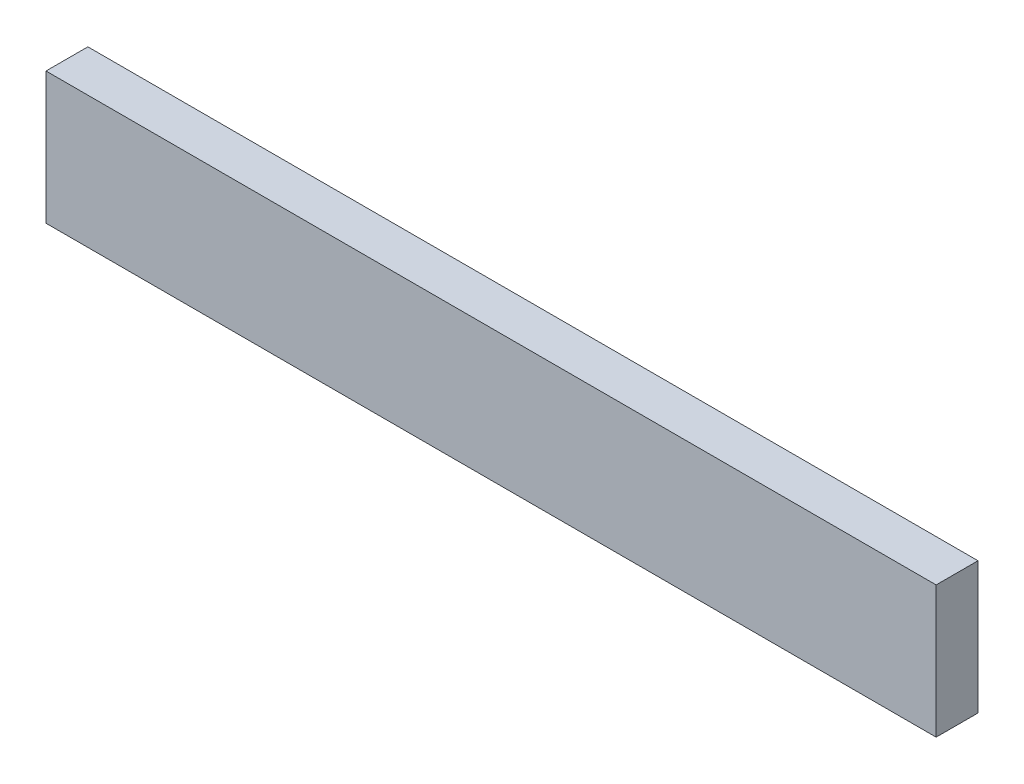
ISO-10303-21;
HEADER;
FILE_DESCRIPTION(('STEP AP214'),'2;1');
FILE_NAME('part.step','',(''),(''),'','','');
FILE_SCHEMA(('AUTOMOTIVE_DESIGN { 1 0 10303 214 1 1 1 1 }'));
ENDSEC;
DATA;
#1=APPLICATION_CONTEXT('core data for automotive mechanical design processes');
#2=APPLICATION_PROTOCOL_DEFINITION('international standard','automotive_design',2000,#1);
#3=PRODUCT_CONTEXT('',#1,'mechanical');
#4=PRODUCT('Part','Part','',(#3));
#5=PRODUCT_RELATED_PRODUCT_CATEGORY('part','',(#4));
#6=PRODUCT_DEFINITION_FORMATION('','',#4);
#7=PRODUCT_DEFINITION_CONTEXT('part definition',#1,'design');
#8=PRODUCT_DEFINITION('design','',#6,#7);
#9=PRODUCT_DEFINITION_SHAPE('','',#8);
#10=(LENGTH_UNIT() NAMED_UNIT(*) SI_UNIT(.MILLI.,.METRE.));
#11=(NAMED_UNIT(*) PLANE_ANGLE_UNIT() SI_UNIT($,.RADIAN.));
#12=(NAMED_UNIT(*) SI_UNIT($,.STERADIAN.) SOLID_ANGLE_UNIT());
#13=UNCERTAINTY_MEASURE_WITH_UNIT(LENGTH_MEASURE(1.E-05),#10,'distance_accuracy_value','');
#14=(GEOMETRIC_REPRESENTATION_CONTEXT(3) GLOBAL_UNCERTAINTY_ASSIGNED_CONTEXT((#13)) GLOBAL_UNIT_ASSIGNED_CONTEXT((#10,
#11,#12)) REPRESENTATION_CONTEXT('',''));
#15=CARTESIAN_POINT('',(0.,0.,0.));
#16=DIRECTION('',(0.,0.,1.));
#17=DIRECTION('',(1.,0.,0.));
#18=AXIS2_PLACEMENT_3D('',#15,#16,#17);
#19=CARTESIAN_POINT('',(135.,-20.,12.7));
#20=DIRECTION('',(-1.,0.,0.));
#21=DIRECTION('',(0.,0.,1.));
#22=AXIS2_PLACEMENT_3D('',#19,#20,#21);
#23=PLANE('',#22);
#24=DIRECTION('',(0.,1.,0.));
#25=VECTOR('',#24,1.);
#26=CARTESIAN_POINT('',(135.,-20.,0.));
#27=LINE('',#26,#25);
#28=CARTESIAN_POINT('',(135.,-20.,0.));
#29=VERTEX_POINT('',#28);
#30=CARTESIAN_POINT('',(135.,20.,0.));
#31=VERTEX_POINT('',#30);
#32=EDGE_CURVE('E113',#29,#31,#27,.T.);
#33=ORIENTED_EDGE('',*,*,#32,.T.);
#34=DIRECTION('',(0.,0.,-1.));
#35=VECTOR('',#34,1.);
#36=CARTESIAN_POINT('',(135.,20.,12.7));
#37=LINE('',#36,#35);
#38=CARTESIAN_POINT('',(135.,20.,12.7));
#39=VERTEX_POINT('',#38);
#40=EDGE_CURVE('E11',#39,#31,#37,.T.);
#41=ORIENTED_EDGE('',*,*,#40,.F.);
#42=DIRECTION('',(0.,1.,0.));
#43=VECTOR('',#42,1.);
#44=CARTESIAN_POINT('',(135.,-20.,12.7));
#45=LINE('',#44,#43);
#46=CARTESIAN_POINT('',(135.,-20.,12.7));
#47=VERTEX_POINT('',#46);
#48=EDGE_CURVE('E97',#47,#39,#45,.T.);
#49=ORIENTED_EDGE('',*,*,#48,.F.);
#50=DIRECTION('',(0.,0.,-1.));
#51=VECTOR('',#50,1.);
#52=CARTESIAN_POINT('',(135.,-20.,12.7));
#53=LINE('',#52,#51);
#54=EDGE_CURVE('E109',#47,#29,#53,.T.);
#55=ORIENTED_EDGE('',*,*,#54,.T.);
#56=EDGE_LOOP('',(#33,#41,#49,#55));
#57=FACE_BOUND('',#56,.T.);
#58=ADVANCED_FACE('F45',(#57),#23,.F.);
#59=CARTESIAN_POINT('',(-135.,20.,12.7));
#60=DIRECTION('',(0.,-1.,0.));
#61=DIRECTION('',(0.,0.,-1.));
#62=AXIS2_PLACEMENT_3D('',#59,#60,#61);
#63=PLANE('',#62);
#64=DIRECTION('',(-1.,0.,0.));
#65=VECTOR('',#64,1.);
#66=CARTESIAN_POINT('',(-135.,20.,0.));
#67=LINE('',#66,#65);
#68=CARTESIAN_POINT('',(-135.,20.,0.));
#69=VERTEX_POINT('',#68);
#70=EDGE_CURVE('E102',#31,#69,#67,.T.);
#71=ORIENTED_EDGE('',*,*,#70,.T.);
#72=DIRECTION('',(0.,0.,-1.));
#73=VECTOR('',#72,1.);
#74=CARTESIAN_POINT('',(-135.,20.,12.7));
#75=LINE('',#74,#73);
#76=CARTESIAN_POINT('',(-135.,20.,12.7));
#77=VERTEX_POINT('',#76);
#78=EDGE_CURVE('E54',#77,#69,#75,.T.);
#79=ORIENTED_EDGE('',*,*,#78,.F.);
#80=DIRECTION('',(-1.,0.,0.));
#81=VECTOR('',#80,1.);
#82=CARTESIAN_POINT('',(-135.,20.,12.7));
#83=LINE('',#82,#81);
#84=EDGE_CURVE('E92',#39,#77,#83,.T.);
#85=ORIENTED_EDGE('',*,*,#84,.F.);
#86=ORIENTED_EDGE('',*,*,#40,.T.);
#87=EDGE_LOOP('',(#71,#79,#85,#86));
#88=FACE_BOUND('',#87,.T.);
#89=ADVANCED_FACE('F101',(#88),#63,.F.);
#90=CARTESIAN_POINT('',(-135.,-20.,12.7));
#91=DIRECTION('',(1.,0.,0.));
#92=DIRECTION('',(0.,0.,-1.));
#93=AXIS2_PLACEMENT_3D('',#90,#91,#92);
#94=PLANE('',#93);
#95=DIRECTION('',(0.,-1.,0.));
#96=VECTOR('',#95,1.);
#97=CARTESIAN_POINT('',(-135.,-20.,0.));
#98=LINE('',#97,#96);
#99=CARTESIAN_POINT('',(-135.,-20.,0.));
#100=VERTEX_POINT('',#99);
#101=EDGE_CURVE('E79',#69,#100,#98,.T.);
#102=ORIENTED_EDGE('',*,*,#101,.T.);
#103=DIRECTION('',(0.,0.,-1.));
#104=VECTOR('',#103,1.);
#105=CARTESIAN_POINT('',(-135.,-20.,12.7));
#106=LINE('',#105,#104);
#107=CARTESIAN_POINT('',(-135.,-20.,12.7));
#108=VERTEX_POINT('',#107);
#109=EDGE_CURVE('E104',#108,#100,#106,.T.);
#110=ORIENTED_EDGE('',*,*,#109,.F.);
#111=DIRECTION('',(0.,-1.,0.));
#112=VECTOR('',#111,1.);
#113=CARTESIAN_POINT('',(-135.,-20.,12.7));
#114=LINE('',#113,#112);
#115=EDGE_CURVE('E95',#77,#108,#114,.T.);
#116=ORIENTED_EDGE('',*,*,#115,.F.);
#117=ORIENTED_EDGE('',*,*,#78,.T.);
#118=EDGE_LOOP('',(#102,#110,#116,#117));
#119=FACE_BOUND('',#118,.T.);
#120=ADVANCED_FACE('F105',(#119),#94,.F.);
#121=CARTESIAN_POINT('',(-135.,-20.,12.7));
#122=DIRECTION('',(0.,1.,0.));
#123=DIRECTION('',(0.,0.,1.));
#124=AXIS2_PLACEMENT_3D('',#121,#122,#123);
#125=PLANE('',#124);
#126=DIRECTION('',(1.,0.,0.));
#127=VECTOR('',#126,1.);
#128=CARTESIAN_POINT('',(-135.,-20.,0.));
#129=LINE('',#128,#127);
#130=EDGE_CURVE('E85',#100,#29,#129,.T.);
#131=ORIENTED_EDGE('',*,*,#130,.T.);
#132=ORIENTED_EDGE('',*,*,#54,.F.);
#133=DIRECTION('',(1.,0.,0.));
#134=VECTOR('',#133,1.);
#135=CARTESIAN_POINT('',(-135.,-20.,12.7));
#136=LINE('',#135,#134);
#137=EDGE_CURVE('E62',#108,#47,#136,.T.);
#138=ORIENTED_EDGE('',*,*,#137,.F.);
#139=ORIENTED_EDGE('',*,*,#109,.T.);
#140=EDGE_LOOP('',(#131,#132,#138,#139));
#141=FACE_BOUND('',#140,.T.);
#142=ADVANCED_FACE('F126',(#141),#125,.F.);
#143=CARTESIAN_POINT('',(0.,0.,12.7));
#144=DIRECTION('',(0.,0.,-1.));
#145=DIRECTION('',(-1.,0.,0.));
#146=AXIS2_PLACEMENT_3D('',#143,#144,#145);
#147=PLANE('',#146);
#148=ORIENTED_EDGE('',*,*,#48,.T.);
#149=ORIENTED_EDGE('',*,*,#84,.T.);
#150=ORIENTED_EDGE('',*,*,#115,.T.);
#151=ORIENTED_EDGE('',*,*,#137,.T.);
#152=EDGE_LOOP('',(#148,#149,#150,#151));
#153=FACE_BOUND('',#152,.T.);
#154=ADVANCED_FACE('F93',(#153),#147,.F.);
#155=CARTESIAN_POINT('',(0.,0.,0.));
#156=DIRECTION('',(0.,0.,-1.));
#157=DIRECTION('',(-1.,0.,0.));
#158=AXIS2_PLACEMENT_3D('',#155,#156,#157);
#159=PLANE('',#158);
#160=ORIENTED_EDGE('',*,*,#32,.F.);
#161=ORIENTED_EDGE('',*,*,#130,.F.);
#162=ORIENTED_EDGE('',*,*,#101,.F.);
#163=ORIENTED_EDGE('',*,*,#70,.F.);
#164=EDGE_LOOP('',(#160,#161,#162,#163));
#165=FACE_BOUND('',#164,.T.);
#166=ADVANCED_FACE('F129',(#165),#159,.T.);
#167=CLOSED_SHELL('',(#58,#89,#120,#142,#154,#166));
#168=MANIFOLD_SOLID_BREP('B2',#167);
#169=ADVANCED_BREP_SHAPE_REPRESENTATION('',(#18,#168),#14);
#170=SHAPE_DEFINITION_REPRESENTATION(#9,#169);
ENDSEC;
END-ISO-10303-21;
